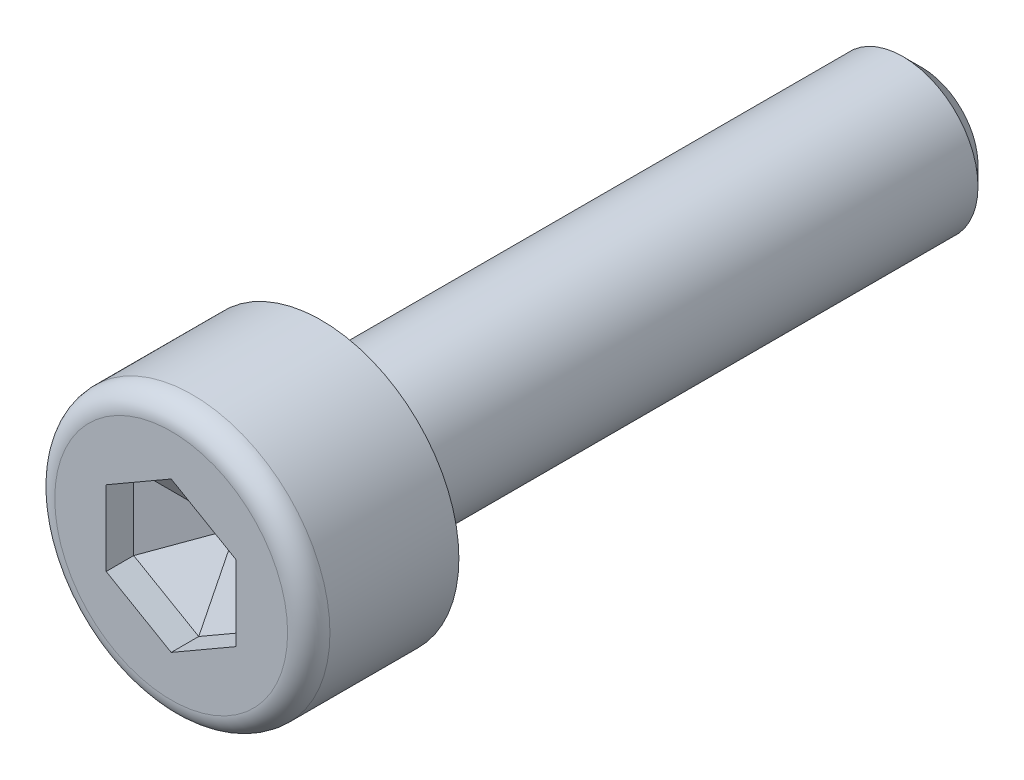
ISO-10303-21;
HEADER;
FILE_DESCRIPTION(('STEP AP214'),'2;1');
FILE_NAME('part.step','',(''),(''),'','','');
FILE_SCHEMA(('AUTOMOTIVE_DESIGN { 1 0 10303 214 1 1 1 1 }'));
ENDSEC;
DATA;
#1=APPLICATION_CONTEXT('core data for automotive mechanical design processes');
#2=APPLICATION_PROTOCOL_DEFINITION('international standard','automotive_design',2000,#1);
#3=PRODUCT_CONTEXT('',#1,'mechanical');
#4=PRODUCT('Part','Part','',(#3));
#5=PRODUCT_RELATED_PRODUCT_CATEGORY('part','',(#4));
#6=PRODUCT_DEFINITION_FORMATION('','',#4);
#7=PRODUCT_DEFINITION_CONTEXT('part definition',#1,'design');
#8=PRODUCT_DEFINITION('design','',#6,#7);
#9=PRODUCT_DEFINITION_SHAPE('','',#8);
#10=(LENGTH_UNIT() NAMED_UNIT(*) SI_UNIT(.MILLI.,.METRE.));
#11=(NAMED_UNIT(*) PLANE_ANGLE_UNIT() SI_UNIT($,.RADIAN.));
#12=(NAMED_UNIT(*) SI_UNIT($,.STERADIAN.) SOLID_ANGLE_UNIT());
#13=UNCERTAINTY_MEASURE_WITH_UNIT(LENGTH_MEASURE(1.E-05),#10,'distance_accuracy_value','');
#14=(GEOMETRIC_REPRESENTATION_CONTEXT(3) GLOBAL_UNCERTAINTY_ASSIGNED_CONTEXT((#13)) GLOBAL_UNIT_ASSIGNED_CONTEXT((#10,
#11,#12)) REPRESENTATION_CONTEXT('',''));
#15=CARTESIAN_POINT('',(0.,0.,0.));
#16=DIRECTION('',(0.,0.,1.));
#17=DIRECTION('',(1.,0.,0.));
#18=AXIS2_PLACEMENT_3D('',#15,#16,#17);
#19=CARTESIAN_POINT('',(0.,0.,0.));
#20=DIRECTION('',(0.,0.,1.));
#21=DIRECTION('',(1.,0.,0.));
#22=AXIS2_PLACEMENT_3D('',#19,#20,#21);
#23=PLANE('',#22);
#24=CARTESIAN_POINT('',(0.,0.,0.));
#25=DIRECTION('',(0.,0.,1.));
#26=DIRECTION('',(1.,0.,0.));
#27=AXIS2_PLACEMENT_3D('',#24,#25,#26);
#28=CIRCLE('',#27,1.6);
#29=CARTESIAN_POINT('',(1.6,0.,0.));
#30=VERTEX_POINT('',#29);
#31=EDGE_CURVE('E11',#30,#30,#28,.T.);
#32=ORIENTED_EDGE('',*,*,#31,.T.);
#33=EDGE_LOOP('',(#32));
#34=FACE_BOUND('',#33,.T.);
#35=CARTESIAN_POINT('',(0.,0.,0.));
#36=DIRECTION('',(0.,0.,1.));
#37=DIRECTION('',(1.,0.,0.));
#38=AXIS2_PLACEMENT_3D('',#35,#36,#37);
#39=CIRCLE('',#38,2.75);
#40=CARTESIAN_POINT('',(2.75,0.,0.));
#41=VERTEX_POINT('',#40);
#42=EDGE_CURVE('E154',#41,#41,#39,.T.);
#43=ORIENTED_EDGE('',*,*,#42,.F.);
#44=EDGE_LOOP('',(#43));
#45=FACE_BOUND('',#44,.T.);
#46=ADVANCED_FACE('F44',(#34,#45),#23,.F.);
#47=CARTESIAN_POINT('',(0.,0.,3.));
#48=DIRECTION('',(0.,0.,-1.));
#49=DIRECTION('',(-1.,0.,0.));
#50=AXIS2_PLACEMENT_3D('',#47,#48,#49);
#51=CYLINDRICAL_SURFACE('',#50,2.75);
#52=CARTESIAN_POINT('',(0.,0.,2.57692307692308));
#53=DIRECTION('',(0.,0.,1.));
#54=DIRECTION('',(1.,0.,0.));
#55=AXIS2_PLACEMENT_3D('',#52,#53,#54);
#56=CIRCLE('',#55,2.75);
#57=CARTESIAN_POINT('',(2.75,0.,2.57692307692308));
#58=VERTEX_POINT('',#57);
#59=EDGE_CURVE('E173',#58,#58,#56,.F.);
#60=ORIENTED_EDGE('',*,*,#59,.T.);
#61=EDGE_LOOP('',(#60));
#62=FACE_BOUND('',#61,.T.);
#63=ORIENTED_EDGE('',*,*,#42,.T.);
#64=EDGE_LOOP('',(#63));
#65=FACE_BOUND('',#64,.T.);
#66=ADVANCED_FACE('F235',(#62,#65),#51,.T.);
#67=CARTESIAN_POINT('',(0.,0.,3.));
#68=DIRECTION('',(0.,0.,1.));
#69=DIRECTION('',(1.,0.,0.));
#70=AXIS2_PLACEMENT_3D('',#67,#68,#69);
#71=PLANE('',#70);
#72=CARTESIAN_POINT('',(0.,0.,3.));
#73=DIRECTION('',(0.,0.,1.));
#74=DIRECTION('',(1.,0.,0.));
#75=AXIS2_PLACEMENT_3D('',#72,#73,#74);
#76=CIRCLE('',#75,2.32692307692308);
#77=CARTESIAN_POINT('',(2.32692307692308,0.,3.));
#78=VERTEX_POINT('',#77);
#79=EDGE_CURVE('E167',#78,#78,#76,.T.);
#80=ORIENTED_EDGE('',*,*,#79,.T.);
#81=EDGE_LOOP('',(#80));
#82=FACE_BOUND('',#81,.T.);
#83=DIRECTION('',(0.,1.,0.));
#84=VECTOR('',#83,1.);
#85=CARTESIAN_POINT('',(1.3,-0.750555349946514,3.));
#86=LINE('',#85,#84);
#87=CARTESIAN_POINT('',(1.3,-0.750555349946514,3.));
#88=VERTEX_POINT('',#87);
#89=CARTESIAN_POINT('',(1.3,0.750555349946514,3.));
#90=VERTEX_POINT('',#89);
#91=EDGE_CURVE('E140',#88,#90,#86,.T.);
#92=ORIENTED_EDGE('',*,*,#91,.F.);
#93=DIRECTION('',(0.866025403784439,0.5,0.));
#94=VECTOR('',#93,1.);
#95=CARTESIAN_POINT('',(0.,-1.50111069989303,3.));
#96=LINE('',#95,#94);
#97=CARTESIAN_POINT('',(0.,-1.50111069989303,3.));
#98=VERTEX_POINT('',#97);
#99=EDGE_CURVE('E149',#98,#88,#96,.T.);
#100=ORIENTED_EDGE('',*,*,#99,.F.);
#101=DIRECTION('',(0.866025403784439,-0.5,0.));
#102=VECTOR('',#101,1.);
#103=CARTESIAN_POINT('',(-1.3,-0.750555349946513,3.));
#104=LINE('',#103,#102);
#105=CARTESIAN_POINT('',(-1.3,-0.750555349946513,3.));
#106=VERTEX_POINT('',#105);
#107=EDGE_CURVE('E144',#106,#98,#104,.T.);
#108=ORIENTED_EDGE('',*,*,#107,.F.);
#109=DIRECTION('',(0.,-1.,0.));
#110=VECTOR('',#109,1.);
#111=CARTESIAN_POINT('',(-1.3,0.750555349946514,3.));
#112=LINE('',#111,#110);
#113=CARTESIAN_POINT('',(-1.3,0.750555349946514,3.));
#114=VERTEX_POINT('',#113);
#115=EDGE_CURVE('E145',#114,#106,#112,.T.);
#116=ORIENTED_EDGE('',*,*,#115,.F.);
#117=DIRECTION('',(-0.866025403784439,-0.5,0.));
#118=VECTOR('',#117,1.);
#119=CARTESIAN_POINT('',(0.,1.50111069989303,3.));
#120=LINE('',#119,#118);
#121=CARTESIAN_POINT('',(0.,1.50111069989303,3.));
#122=VERTEX_POINT('',#121);
#123=EDGE_CURVE('E125',#122,#114,#120,.T.);
#124=ORIENTED_EDGE('',*,*,#123,.F.);
#125=DIRECTION('',(-0.866025403784439,0.5,0.));
#126=VECTOR('',#125,1.);
#127=CARTESIAN_POINT('',(1.3,0.750555349946514,3.));
#128=LINE('',#127,#126);
#129=EDGE_CURVE('E135',#90,#122,#128,.T.);
#130=ORIENTED_EDGE('',*,*,#129,.F.);
#131=EDGE_LOOP('',(#92,#100,#108,#116,#124,#130));
#132=FACE_BOUND('',#131,.T.);
#133=ADVANCED_FACE('F137',(#82,#132),#71,.T.);
#134=CARTESIAN_POINT('',(1.3,-0.750555349946514,1.7));
#135=DIRECTION('',(1.,0.,0.));
#136=DIRECTION('',(0.,1.,0.));
#137=AXIS2_PLACEMENT_3D('',#134,#135,#136);
#138=PLANE('',#137);
#139=DIRECTION('',(0.,0.,1.));
#140=VECTOR('',#139,1.);
#141=CARTESIAN_POINT('',(1.3,0.750555349946514,1.7));
#142=LINE('',#141,#140);
#143=CARTESIAN_POINT('',(1.3,0.750555349946514,2.4492795389049));
#144=VERTEX_POINT('',#143);
#145=EDGE_CURVE('E127',#144,#90,#142,.T.);
#146=ORIENTED_EDGE('',*,*,#145,.F.);
#147=DIRECTION('',(0.,-1.,0.));
#148=VECTOR('',#147,1.);
#149=CARTESIAN_POINT('',(1.3,-0.750555349946514,2.4492795389049));
#150=LINE('',#149,#148);
#151=CARTESIAN_POINT('',(1.3,-0.750555349946514,2.4492795389049));
#152=VERTEX_POINT('',#151);
#153=EDGE_CURVE('E67',#144,#152,#150,.T.);
#154=ORIENTED_EDGE('',*,*,#153,.T.);
#155=DIRECTION('',(0.,0.,1.));
#156=VECTOR('',#155,1.);
#157=CARTESIAN_POINT('',(1.3,-0.750555349946514,1.7));
#158=LINE('',#157,#156);
#159=EDGE_CURVE('E152',#152,#88,#158,.T.);
#160=ORIENTED_EDGE('',*,*,#159,.T.);
#161=ORIENTED_EDGE('',*,*,#91,.T.);
#162=EDGE_LOOP('',(#146,#154,#160,#161));
#163=FACE_BOUND('',#162,.T.);
#164=ADVANCED_FACE('F292',(#163),#138,.F.);
#165=CARTESIAN_POINT('',(0.,-1.50111069989303,1.7));
#166=DIRECTION('',(0.5,-0.866025403784439,0.));
#167=DIRECTION('',(0.866025403784439,0.5,0.));
#168=AXIS2_PLACEMENT_3D('',#165,#166,#167);
#169=PLANE('',#168);
#170=ORIENTED_EDGE('',*,*,#159,.F.);
#171=DIRECTION('',(-0.866025403784439,-0.5,0.));
#172=VECTOR('',#171,1.);
#173=CARTESIAN_POINT('',(0.,-1.50111069989303,2.4492795389049));
#174=LINE('',#173,#172);
#175=CARTESIAN_POINT('',(0.,-1.50111069989303,2.4492795389049));
#176=VERTEX_POINT('',#175);
#177=EDGE_CURVE('E58',#152,#176,#174,.T.);
#178=ORIENTED_EDGE('',*,*,#177,.T.);
#179=DIRECTION('',(0.,0.,1.));
#180=VECTOR('',#179,1.);
#181=CARTESIAN_POINT('',(0.,-1.50111069989303,1.7));
#182=LINE('',#181,#180);
#183=EDGE_CURVE('E156',#176,#98,#182,.T.);
#184=ORIENTED_EDGE('',*,*,#183,.T.);
#185=ORIENTED_EDGE('',*,*,#99,.T.);
#186=EDGE_LOOP('',(#170,#178,#184,#185));
#187=FACE_BOUND('',#186,.T.);
#188=ADVANCED_FACE('F295',(#187),#169,.F.);
#189=CARTESIAN_POINT('',(-1.3,-0.750555349946513,1.7));
#190=DIRECTION('',(-0.5,-0.866025403784439,0.));
#191=DIRECTION('',(0.866025403784439,-0.5,0.));
#192=AXIS2_PLACEMENT_3D('',#189,#190,#191);
#193=PLANE('',#192);
#194=ORIENTED_EDGE('',*,*,#183,.F.);
#195=DIRECTION('',(-0.866025403784439,0.5,0.));
#196=VECTOR('',#195,1.);
#197=CARTESIAN_POINT('',(-1.3,-0.750555349946513,2.4492795389049));
#198=LINE('',#197,#196);
#199=CARTESIAN_POINT('',(-1.3,-0.750555349946513,2.4492795389049));
#200=VERTEX_POINT('',#199);
#201=EDGE_CURVE('E196',#176,#200,#198,.T.);
#202=ORIENTED_EDGE('',*,*,#201,.T.);
#203=DIRECTION('',(0.,0.,1.));
#204=VECTOR('',#203,1.);
#205=CARTESIAN_POINT('',(-1.3,-0.750555349946513,1.7));
#206=LINE('',#205,#204);
#207=EDGE_CURVE('E158',#200,#106,#206,.T.);
#208=ORIENTED_EDGE('',*,*,#207,.T.);
#209=ORIENTED_EDGE('',*,*,#107,.T.);
#210=EDGE_LOOP('',(#194,#202,#208,#209));
#211=FACE_BOUND('',#210,.T.);
#212=ADVANCED_FACE('F282',(#211),#193,.F.);
#213=CARTESIAN_POINT('',(-1.3,0.750555349946514,1.7));
#214=DIRECTION('',(-1.,0.,0.));
#215=DIRECTION('',(0.,0.,1.));
#216=AXIS2_PLACEMENT_3D('',#213,#214,#215);
#217=PLANE('',#216);
#218=ORIENTED_EDGE('',*,*,#207,.F.);
#219=DIRECTION('',(0.,1.,0.));
#220=VECTOR('',#219,1.);
#221=CARTESIAN_POINT('',(-1.3,0.750555349946514,2.4492795389049));
#222=LINE('',#221,#220);
#223=CARTESIAN_POINT('',(-1.3,0.750555349946514,2.4492795389049));
#224=VERTEX_POINT('',#223);
#225=EDGE_CURVE('E186',#200,#224,#222,.T.);
#226=ORIENTED_EDGE('',*,*,#225,.T.);
#227=DIRECTION('',(0.,0.,1.));
#228=VECTOR('',#227,1.);
#229=CARTESIAN_POINT('',(-1.3,0.750555349946514,1.7));
#230=LINE('',#229,#228);
#231=EDGE_CURVE('E126',#224,#114,#230,.T.);
#232=ORIENTED_EDGE('',*,*,#231,.T.);
#233=ORIENTED_EDGE('',*,*,#115,.T.);
#234=EDGE_LOOP('',(#218,#226,#232,#233));
#235=FACE_BOUND('',#234,.T.);
#236=ADVANCED_FACE('F286',(#235),#217,.F.);
#237=CARTESIAN_POINT('',(0.,1.50111069989303,1.7));
#238=DIRECTION('',(-0.5,0.866025403784439,0.));
#239=DIRECTION('',(-0.866025403784439,-0.5,0.));
#240=AXIS2_PLACEMENT_3D('',#237,#238,#239);
#241=PLANE('',#240);
#242=ORIENTED_EDGE('',*,*,#231,.F.);
#243=DIRECTION('',(0.866025403784439,0.5,0.));
#244=VECTOR('',#243,1.);
#245=CARTESIAN_POINT('',(0.,1.50111069989303,2.4492795389049));
#246=LINE('',#245,#244);
#247=CARTESIAN_POINT('',(0.,1.50111069989303,2.4492795389049));
#248=VERTEX_POINT('',#247);
#249=EDGE_CURVE('E123',#224,#248,#246,.T.);
#250=ORIENTED_EDGE('',*,*,#249,.T.);
#251=DIRECTION('',(0.,0.,1.));
#252=VECTOR('',#251,1.);
#253=CARTESIAN_POINT('',(0.,1.50111069989303,1.7));
#254=LINE('',#253,#252);
#255=EDGE_CURVE('E120',#248,#122,#254,.T.);
#256=ORIENTED_EDGE('',*,*,#255,.T.);
#257=ORIENTED_EDGE('',*,*,#123,.T.);
#258=EDGE_LOOP('',(#242,#250,#256,#257));
#259=FACE_BOUND('',#258,.T.);
#260=ADVANCED_FACE('F119',(#259),#241,.F.);
#261=CARTESIAN_POINT('',(1.3,0.750555349946514,1.7));
#262=DIRECTION('',(0.5,0.866025403784439,0.));
#263=DIRECTION('',(-0.866025403784439,0.5,0.));
#264=AXIS2_PLACEMENT_3D('',#261,#262,#263);
#265=PLANE('',#264);
#266=ORIENTED_EDGE('',*,*,#255,.F.);
#267=DIRECTION('',(0.866025403784439,-0.5,0.));
#268=VECTOR('',#267,1.);
#269=CARTESIAN_POINT('',(1.3,0.750555349946514,2.4492795389049));
#270=LINE('',#269,#268);
#271=EDGE_CURVE('E191',#248,#144,#270,.T.);
#272=ORIENTED_EDGE('',*,*,#271,.T.);
#273=ORIENTED_EDGE('',*,*,#145,.T.);
#274=ORIENTED_EDGE('',*,*,#129,.T.);
#275=EDGE_LOOP('',(#266,#272,#273,#274));
#276=FACE_BOUND('',#275,.T.);
#277=ADVANCED_FACE('F132',(#276),#265,.F.);
#278=CARTESIAN_POINT('',(0.,0.,1.7));
#279=DIRECTION('',(0.,0.,1.));
#280=DIRECTION('',(1.,0.,0.));
#281=AXIS2_PLACEMENT_3D('',#278,#279,#280);
#282=PLANE('',#281);
#283=DIRECTION('',(-0.866025403784439,-0.5,0.));
#284=VECTOR('',#283,1.);
#285=CARTESIAN_POINT('',(-0.00110488477246046,0.0019137165624107,1.7));
#286=LINE('',#285,#284);
#287=CARTESIAN_POINT('',(0.,0.00255162208321397,1.7));
#288=VERTEX_POINT('',#287);
#289=CARTESIAN_POINT('',(-0.00220976954492082,0.00127581104160717,1.7));
#290=VERTEX_POINT('',#289);
#291=EDGE_CURVE('E183',#288,#290,#286,.T.);
#292=ORIENTED_EDGE('',*,*,#291,.T.);
#293=DIRECTION('',(0.,-1.,0.));
#294=VECTOR('',#293,1.);
#295=CARTESIAN_POINT('',(-0.00220976954492082,0.,1.7));
#296=LINE('',#295,#294);
#297=CARTESIAN_POINT('',(-0.00220976954492082,-0.00127581104160661,1.7));
#298=VERTEX_POINT('',#297);
#299=EDGE_CURVE('E187',#290,#298,#296,.T.);
#300=ORIENTED_EDGE('',*,*,#299,.T.);
#301=DIRECTION('',(0.866025403784439,-0.5,0.));
#302=VECTOR('',#301,1.);
#303=CARTESIAN_POINT('',(-0.00110488477246022,-0.00191371656241028,1.7));
#304=LINE('',#303,#302);
#305=CARTESIAN_POINT('',(0.,-0.00255162208321376,1.7));
#306=VERTEX_POINT('',#305);
#307=EDGE_CURVE('E178',#298,#306,#304,.T.);
#308=ORIENTED_EDGE('',*,*,#307,.T.);
#309=DIRECTION('',(0.866025403784439,0.5,0.));
#310=VECTOR('',#309,1.);
#311=CARTESIAN_POINT('',(0.0011048847724603,-0.00191371656241042,1.7));
#312=LINE('',#311,#310);
#313=CARTESIAN_POINT('',(0.00220976954492071,-0.00127581104160689,1.7));
#314=VERTEX_POINT('',#313);
#315=EDGE_CURVE('E176',#306,#314,#312,.T.);
#316=ORIENTED_EDGE('',*,*,#315,.T.);
#317=DIRECTION('',(0.,1.,0.));
#318=VECTOR('',#317,1.);
#319=CARTESIAN_POINT('',(0.00220976954492071,0.,1.7));
#320=LINE('',#319,#318);
#321=CARTESIAN_POINT('',(0.00220976954492071,0.00127581104160669,1.7));
#322=VERTEX_POINT('',#321);
#323=EDGE_CURVE('E179',#314,#322,#320,.T.);
#324=ORIENTED_EDGE('',*,*,#323,.T.);
#325=DIRECTION('',(-0.866025403784439,0.5,0.));
#326=VECTOR('',#325,1.);
#327=CARTESIAN_POINT('',(0.00110488477246022,0.00191371656241028,1.7));
#328=LINE('',#327,#326);
#329=EDGE_CURVE('E185',#322,#288,#328,.T.);
#330=ORIENTED_EDGE('',*,*,#329,.T.);
#331=EDGE_LOOP('',(#292,#300,#308,#316,#324,#330));
#332=FACE_BOUND('',#331,.T.);
#333=ADVANCED_FACE('F303',(#332),#282,.T.);
#334=CARTESIAN_POINT('',(0.,0.,-12.));
#335=DIRECTION('',(0.,0.,1.));
#336=DIRECTION('',(1.,0.,0.));
#337=AXIS2_PLACEMENT_3D('',#334,#335,#336);
#338=CYLINDRICAL_SURFACE('',#337,1.5);
#339=CARTESIAN_POINT('',(0.,0.,-0.0999999999999994));
#340=DIRECTION('',(0.,0.,1.));
#341=DIRECTION('',(1.,0.,0.));
#342=AXIS2_PLACEMENT_3D('',#339,#340,#341);
#343=CIRCLE('',#342,1.5);
#344=CARTESIAN_POINT('',(1.5,0.,-0.0999999999999994));
#345=VERTEX_POINT('',#344);
#346=EDGE_CURVE('E52',#345,#345,#343,.F.);
#347=ORIENTED_EDGE('',*,*,#346,.T.);
#348=EDGE_LOOP('',(#347));
#349=FACE_BOUND('',#348,.T.);
#350=CARTESIAN_POINT('',(0.,0.,-11.625));
#351=DIRECTION('',(0.,0.,-1.));
#352=DIRECTION('',(-1.,0.,0.));
#353=AXIS2_PLACEMENT_3D('',#350,#351,#352);
#354=CIRCLE('',#353,1.5);
#355=CARTESIAN_POINT('',(-1.5,0.,-11.625));
#356=VERTEX_POINT('',#355);
#357=EDGE_CURVE('E170',#356,#356,#354,.F.);
#358=ORIENTED_EDGE('',*,*,#357,.T.);
#359=EDGE_LOOP('',(#358));
#360=FACE_BOUND('',#359,.T.);
#361=ADVANCED_FACE('F220',(#349,#360),#338,.T.);
#362=CARTESIAN_POINT('',(0.,0.,-12.));
#363=DIRECTION('',(0.,0.,-1.));
#364=DIRECTION('',(-1.,0.,0.));
#365=AXIS2_PLACEMENT_3D('',#362,#363,#364);
#366=PLANE('',#365);
#367=CARTESIAN_POINT('',(0.,0.,-12.));
#368=DIRECTION('',(0.,0.,-1.));
#369=DIRECTION('',(-1.,0.,0.));
#370=AXIS2_PLACEMENT_3D('',#367,#368,#369);
#371=CIRCLE('',#370,1.125);
#372=CARTESIAN_POINT('',(-1.125,0.,-12.));
#373=VERTEX_POINT('',#372);
#374=EDGE_CURVE('E165',#373,#373,#371,.T.);
#375=ORIENTED_EDGE('',*,*,#374,.T.);
#376=EDGE_LOOP('',(#375));
#377=FACE_BOUND('',#376,.T.);
#378=ADVANCED_FACE('F247',(#377),#366,.T.);
#379=CARTESIAN_POINT('',(0.,0.,-12.));
#380=DIRECTION('',(0.,0.,1.));
#381=DIRECTION('',(1.,0.,0.));
#382=AXIS2_PLACEMENT_3D('',#379,#380,#381);
#383=CONICAL_SURFACE('',#382,1.125,0.785398163397447);
#384=ORIENTED_EDGE('',*,*,#357,.F.);
#385=EDGE_LOOP('',(#384));
#386=FACE_BOUND('',#385,.T.);
#387=ORIENTED_EDGE('',*,*,#374,.F.);
#388=EDGE_LOOP('',(#387));
#389=FACE_BOUND('',#388,.T.);
#390=ADVANCED_FACE('F242',(#386,#389),#383,.T.);
#391=CARTESIAN_POINT('',(0.,0.,2.57692307692308));
#392=DIRECTION('',(0.,0.,1.));
#393=DIRECTION('',(1.,0.,0.));
#394=AXIS2_PLACEMENT_3D('',#391,#392,#393);
#395=TOROIDAL_SURFACE('',#394,2.32692307692308,0.423076923076923);
#396=ORIENTED_EDGE('',*,*,#59,.F.);
#397=EDGE_LOOP('',(#396));
#398=FACE_BOUND('',#397,.T.);
#399=ORIENTED_EDGE('',*,*,#79,.F.);
#400=EDGE_LOOP('',(#399));
#401=FACE_BOUND('',#400,.T.);
#402=ADVANCED_FACE('F250',(#398,#401),#395,.T.);
#403=CARTESIAN_POINT('',(0.00220976954492071,0.,1.7));
#404=DIRECTION('',(0.499999999999995,0.,-0.866025403784441));
#405=DIRECTION('',(0.,1.,0.));
#406=AXIS2_PLACEMENT_3D('',#403,#404,#405);
#407=PLANE('',#406);
#408=DIRECTION('',(-0.774596669241485,0.447213595499959,-0.447213595499953));
#409=VECTOR('',#408,1.);
#410=CARTESIAN_POINT('',(0.00176781563593661,-0.00102064883328551,1.69974483779168));
#411=LINE('',#410,#409);
#412=EDGE_CURVE('E209',#152,#314,#411,.T.);
#413=ORIENTED_EDGE('',*,*,#412,.F.);
#414=ORIENTED_EDGE('',*,*,#153,.F.);
#415=DIRECTION('',(-0.774596669241485,-0.447213595499959,-0.447213595499953));
#416=VECTOR('',#415,1.);
#417=CARTESIAN_POINT('',(0.00176781563593651,0.00102064883328526,1.69974483779168));
#418=LINE('',#417,#416);
#419=EDGE_CURVE('E215',#322,#144,#418,.F.);
#420=ORIENTED_EDGE('',*,*,#419,.F.);
#421=ORIENTED_EDGE('',*,*,#323,.F.);
#422=EDGE_LOOP('',(#413,#414,#420,#421));
#423=FACE_BOUND('',#422,.T.);
#424=ADVANCED_FACE('F252',(#423),#407,.F.);
#425=CARTESIAN_POINT('',(0.00110488477246022,0.00191371656241028,1.7));
#426=DIRECTION('',(0.249999999999997,0.433012701892215,-0.866025403784441));
#427=DIRECTION('',(-0.866025403784439,0.5,0.));
#428=AXIS2_PLACEMENT_3D('',#425,#426,#427);
#429=PLANE('',#428);
#430=ORIENTED_EDGE('',*,*,#419,.T.);
#431=ORIENTED_EDGE('',*,*,#271,.F.);
#432=DIRECTION('',(0.,-0.894427190999918,-0.447213595499953));
#433=VECTOR('',#432,1.);
#434=CARTESIAN_POINT('',(0.,0.00204129766657131,1.69974483779168));
#435=LINE('',#434,#433);
#436=EDGE_CURVE('E207',#288,#248,#435,.F.);
#437=ORIENTED_EDGE('',*,*,#436,.F.);
#438=ORIENTED_EDGE('',*,*,#329,.F.);
#439=EDGE_LOOP('',(#430,#431,#437,#438));
#440=FACE_BOUND('',#439,.T.);
#441=ADVANCED_FACE('F263',(#440),#429,.F.);
#442=CARTESIAN_POINT('',(0.0011048847724603,-0.00191371656241042,1.7));
#443=DIRECTION('',(0.249999999999997,-0.433012701892215,-0.866025403784441));
#444=DIRECTION('',(0.866025403784439,0.5,0.));
#445=AXIS2_PLACEMENT_3D('',#442,#443,#444);
#446=PLANE('',#445);
#447=ORIENTED_EDGE('',*,*,#412,.T.);
#448=ORIENTED_EDGE('',*,*,#315,.F.);
#449=DIRECTION('',(0.,-0.894427190999918,0.447213595499953));
#450=VECTOR('',#449,1.);
#451=CARTESIAN_POINT('',(0.,-0.00204129766657111,1.69974483779168));
#452=LINE('',#451,#450);
#453=EDGE_CURVE('E203',#176,#306,#452,.F.);
#454=ORIENTED_EDGE('',*,*,#453,.F.);
#455=ORIENTED_EDGE('',*,*,#177,.F.);
#456=EDGE_LOOP('',(#447,#448,#454,#455));
#457=FACE_BOUND('',#456,.T.);
#458=ADVANCED_FACE('F259',(#457),#446,.F.);
#459=CARTESIAN_POINT('',(-0.00110488477246044,0.00191371656241066,1.7));
#460=DIRECTION('',(-0.249999999999997,0.433012701892215,-0.866025403784441));
#461=DIRECTION('',(-0.866025403784439,-0.5,0.));
#462=AXIS2_PLACEMENT_3D('',#459,#460,#461);
#463=PLANE('',#462);
#464=ORIENTED_EDGE('',*,*,#436,.T.);
#465=ORIENTED_EDGE('',*,*,#249,.F.);
#466=DIRECTION('',(0.774596669241485,-0.447213595499959,-0.447213595499953));
#467=VECTOR('',#466,1.);
#468=CARTESIAN_POINT('',(-0.00176781563593663,0.00102064883328571,1.69974483779168));
#469=LINE('',#468,#467);
#470=EDGE_CURVE('E201',#290,#224,#469,.F.);
#471=ORIENTED_EDGE('',*,*,#470,.F.);
#472=ORIENTED_EDGE('',*,*,#291,.F.);
#473=EDGE_LOOP('',(#464,#465,#471,#472));
#474=FACE_BOUND('',#473,.T.);
#475=ADVANCED_FACE('F258',(#474),#463,.F.);
#476=CARTESIAN_POINT('',(-0.0011048847724603,-0.00191371656241042,1.7));
#477=DIRECTION('',(-0.249999999999998,-0.433012701892215,-0.866025403784441));
#478=DIRECTION('',(0.866025403784439,-0.5,0.));
#479=AXIS2_PLACEMENT_3D('',#476,#477,#478);
#480=PLANE('',#479);
#481=ORIENTED_EDGE('',*,*,#453,.T.);
#482=ORIENTED_EDGE('',*,*,#307,.F.);
#483=DIRECTION('',(-0.774596669241485,-0.447213595499959,0.447213595499953));
#484=VECTOR('',#483,1.);
#485=CARTESIAN_POINT('',(-0.00176781563593674,-0.00102064883328546,1.69974483779168));
#486=LINE('',#485,#484);
#487=EDGE_CURVE('E198',#200,#298,#486,.F.);
#488=ORIENTED_EDGE('',*,*,#487,.F.);
#489=ORIENTED_EDGE('',*,*,#201,.F.);
#490=EDGE_LOOP('',(#481,#482,#488,#489));
#491=FACE_BOUND('',#490,.T.);
#492=ADVANCED_FACE('F227',(#491),#480,.F.);
#493=CARTESIAN_POINT('',(-0.00220976954492082,0.,1.7));
#494=DIRECTION('',(-0.499999999999995,0.,-0.866025403784441));
#495=DIRECTION('',(0.,-1.,0.));
#496=AXIS2_PLACEMENT_3D('',#493,#494,#495);
#497=PLANE('',#496);
#498=ORIENTED_EDGE('',*,*,#470,.T.);
#499=ORIENTED_EDGE('',*,*,#225,.F.);
#500=ORIENTED_EDGE('',*,*,#487,.T.);
#501=ORIENTED_EDGE('',*,*,#299,.F.);
#502=EDGE_LOOP('',(#498,#499,#500,#501));
#503=FACE_BOUND('',#502,.T.);
#504=ADVANCED_FACE('F221',(#503),#497,.F.);
#505=CARTESIAN_POINT('',(0.,0.,-0.0999999999999994));
#506=DIRECTION('',(0.,0.,1.));
#507=DIRECTION('',(1.,0.,0.));
#508=AXIS2_PLACEMENT_3D('',#505,#506,#507);
#509=TOROIDAL_SURFACE('',#508,1.6,0.1);
#510=ORIENTED_EDGE('',*,*,#31,.F.);
#511=EDGE_LOOP('',(#510));
#512=FACE_BOUND('',#511,.T.);
#513=ORIENTED_EDGE('',*,*,#346,.F.);
#514=EDGE_LOOP('',(#513));
#515=FACE_BOUND('',#514,.T.);
#516=ADVANCED_FACE('F50',(#512,#515),#509,.F.);
#517=CLOSED_SHELL('',(#46,#66,#133,#164,#188,#212,#236,#260,#277,#333,#361,#378,#390,#402,#424,
#441,#458,#475,#492,#504,#516));
#518=MANIFOLD_SOLID_BREP('B2',#517);
#519=ADVANCED_BREP_SHAPE_REPRESENTATION('',(#18,#518),#14);
#520=SHAPE_DEFINITION_REPRESENTATION(#9,#519);
ENDSEC;
END-ISO-10303-21;
